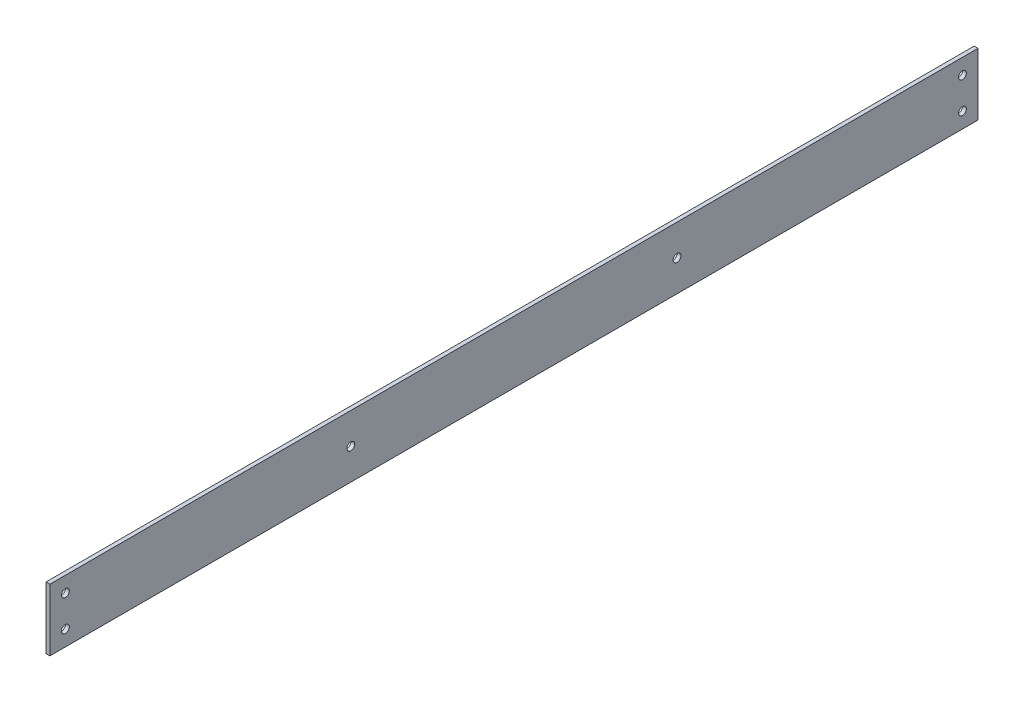
ISO-10303-21;
HEADER;
FILE_DESCRIPTION(('STEP AP214'),'2;1');
FILE_NAME('part.step','',(''),(''),'','','');
FILE_SCHEMA(('AUTOMOTIVE_DESIGN { 1 0 10303 214 1 1 1 1 }'));
ENDSEC;
DATA;
#1=APPLICATION_CONTEXT('core data for automotive mechanical design processes');
#2=APPLICATION_PROTOCOL_DEFINITION('international standard','automotive_design',2000,#1);
#3=PRODUCT_CONTEXT('',#1,'mechanical');
#4=PRODUCT('Part','Part','',(#3));
#5=PRODUCT_RELATED_PRODUCT_CATEGORY('part','',(#4));
#6=PRODUCT_DEFINITION_FORMATION('','',#4);
#7=PRODUCT_DEFINITION_CONTEXT('part definition',#1,'design');
#8=PRODUCT_DEFINITION('design','',#6,#7);
#9=PRODUCT_DEFINITION_SHAPE('','',#8);
#10=(LENGTH_UNIT() NAMED_UNIT(*) SI_UNIT(.MILLI.,.METRE.));
#11=(NAMED_UNIT(*) PLANE_ANGLE_UNIT() SI_UNIT($,.RADIAN.));
#12=(NAMED_UNIT(*) SI_UNIT($,.STERADIAN.) SOLID_ANGLE_UNIT());
#13=UNCERTAINTY_MEASURE_WITH_UNIT(LENGTH_MEASURE(1.E-05),#10,'distance_accuracy_value','');
#14=(GEOMETRIC_REPRESENTATION_CONTEXT(3) GLOBAL_UNCERTAINTY_ASSIGNED_CONTEXT((#13)) GLOBAL_UNIT_ASSIGNED_CONTEXT((#10,
#11,#12)) REPRESENTATION_CONTEXT('',''));
#15=CARTESIAN_POINT('',(0.,0.,0.));
#16=DIRECTION('',(0.,0.,1.));
#17=DIRECTION('',(1.,0.,0.));
#18=AXIS2_PLACEMENT_3D('',#15,#16,#17);
#19=CARTESIAN_POINT('',(1.5875,-25.4,809.625));
#20=DIRECTION('',(-1.,0.,0.));
#21=DIRECTION('',(0.,0.,1.));
#22=AXIS2_PLACEMENT_3D('',#19,#20,#21);
#23=PLANE('',#22);
#24=CARTESIAN_POINT('',(1.5875,0.,271.4625));
#25=DIRECTION('',(-1.,0.,0.));
#26=DIRECTION('',(0.,0.,1.));
#27=AXIS2_PLACEMENT_3D('',#24,#25,#26);
#28=CIRCLE('',#27,3.17499999999997);
#29=CARTESIAN_POINT('',(1.5875,0.,274.6375));
#30=VERTEX_POINT('',#29);
#31=EDGE_CURVE('E105',#30,#30,#28,.T.);
#32=ORIENTED_EDGE('',*,*,#31,.T.);
#33=EDGE_LOOP('',(#32));
#34=FACE_BOUND('',#33,.T.);
#35=CARTESIAN_POINT('',(1.5875,0.,538.1625));
#36=DIRECTION('',(-1.,0.,0.));
#37=DIRECTION('',(0.,0.,1.));
#38=AXIS2_PLACEMENT_3D('',#35,#36,#37);
#39=CIRCLE('',#38,3.17499999999997);
#40=CARTESIAN_POINT('',(1.5875,0.,541.3375));
#41=VERTEX_POINT('',#40);
#42=EDGE_CURVE('E184',#41,#41,#39,.T.);
#43=ORIENTED_EDGE('',*,*,#42,.T.);
#44=EDGE_LOOP('',(#43));
#45=FACE_BOUND('',#44,.T.);
#46=CARTESIAN_POINT('',(1.5875,-12.7,38.1));
#47=DIRECTION('',(1.,0.,0.));
#48=DIRECTION('',(0.,0.,-1.));
#49=AXIS2_PLACEMENT_3D('',#46,#47,#48);
#50=CIRCLE('',#49,3.175);
#51=CARTESIAN_POINT('',(1.5875,-12.7,34.925));
#52=VERTEX_POINT('',#51);
#53=EDGE_CURVE('E125',#52,#52,#50,.T.);
#54=ORIENTED_EDGE('',*,*,#53,.F.);
#55=EDGE_LOOP('',(#54));
#56=FACE_BOUND('',#55,.T.);
#57=CARTESIAN_POINT('',(1.5875,12.7,771.525));
#58=DIRECTION('',(1.,0.,0.));
#59=DIRECTION('',(0.,0.,1.));
#60=AXIS2_PLACEMENT_3D('',#57,#58,#59);
#61=CIRCLE('',#60,3.17500000000008);
#62=CARTESIAN_POINT('',(1.5875,12.7,774.7));
#63=VERTEX_POINT('',#62);
#64=EDGE_CURVE('E115',#63,#63,#61,.T.);
#65=ORIENTED_EDGE('',*,*,#64,.F.);
#66=EDGE_LOOP('',(#65));
#67=FACE_BOUND('',#66,.T.);
#68=CARTESIAN_POINT('',(1.5875,-12.7,771.525));
#69=DIRECTION('',(1.,0.,0.));
#70=DIRECTION('',(0.,0.,1.));
#71=AXIS2_PLACEMENT_3D('',#68,#69,#70);
#72=CIRCLE('',#71,3.17499999999986);
#73=CARTESIAN_POINT('',(1.5875,-12.7,774.7));
#74=VERTEX_POINT('',#73);
#75=EDGE_CURVE('E116',#74,#74,#72,.T.);
#76=ORIENTED_EDGE('',*,*,#75,.F.);
#77=EDGE_LOOP('',(#76));
#78=FACE_BOUND('',#77,.T.);
#79=CARTESIAN_POINT('',(1.5875,12.7,38.1));
#80=DIRECTION('',(1.,0.,0.));
#81=DIRECTION('',(0.,0.,-1.));
#82=AXIS2_PLACEMENT_3D('',#79,#80,#81);
#83=CIRCLE('',#82,3.175);
#84=CARTESIAN_POINT('',(1.5875,12.7,34.925));
#85=VERTEX_POINT('',#84);
#86=EDGE_CURVE('E124',#85,#85,#83,.T.);
#87=ORIENTED_EDGE('',*,*,#86,.F.);
#88=EDGE_LOOP('',(#87));
#89=FACE_BOUND('',#88,.T.);
#90=DIRECTION('',(0.,0.,-1.));
#91=VECTOR('',#90,1.);
#92=CARTESIAN_POINT('',(1.5875,25.4,809.625));
#93=LINE('',#92,#91);
#94=CARTESIAN_POINT('',(1.5875,25.4,784.225));
#95=VERTEX_POINT('',#94);
#96=CARTESIAN_POINT('',(1.5875,25.4,25.4));
#97=VERTEX_POINT('',#96);
#98=EDGE_CURVE('E11',#95,#97,#93,.T.);
#99=ORIENTED_EDGE('',*,*,#98,.F.);
#100=DIRECTION('',(0.,-1.,0.));
#101=VECTOR('',#100,1.);
#102=CARTESIAN_POINT('',(1.5875,-25.4,784.225));
#103=LINE('',#102,#101);
#104=CARTESIAN_POINT('',(1.5875,-25.4,784.225));
#105=VERTEX_POINT('',#104);
#106=EDGE_CURVE('E78',#95,#105,#103,.T.);
#107=ORIENTED_EDGE('',*,*,#106,.T.);
#108=DIRECTION('',(0.,0.,-1.));
#109=VECTOR('',#108,1.);
#110=CARTESIAN_POINT('',(1.5875,-25.4,809.625));
#111=LINE('',#110,#109);
#112=CARTESIAN_POINT('',(1.5875,-25.4,25.4));
#113=VERTEX_POINT('',#112);
#114=EDGE_CURVE('E96',#105,#113,#111,.T.);
#115=ORIENTED_EDGE('',*,*,#114,.T.);
#116=DIRECTION('',(0.,1.,0.));
#117=VECTOR('',#116,1.);
#118=CARTESIAN_POINT('',(1.5875,-25.4,25.4));
#119=LINE('',#118,#117);
#120=EDGE_CURVE('E62',#113,#97,#119,.T.);
#121=ORIENTED_EDGE('',*,*,#120,.T.);
#122=EDGE_LOOP('',(#99,#107,#115,#121));
#123=FACE_BOUND('',#122,.T.);
#124=ADVANCED_FACE('F39',(#34,#45,#56,#67,#78,#89,#123),#23,.F.);
#125=CARTESIAN_POINT('',(-1.5875,25.4,809.625));
#126=DIRECTION('',(0.,-1.,0.));
#127=DIRECTION('',(0.,0.,-1.));
#128=AXIS2_PLACEMENT_3D('',#125,#126,#127);
#129=PLANE('',#128);
#130=DIRECTION('',(0.,0.,-1.));
#131=VECTOR('',#130,1.);
#132=CARTESIAN_POINT('',(-1.5875,25.4,809.625));
#133=LINE('',#132,#131);
#134=CARTESIAN_POINT('',(-1.5875,25.4,784.225));
#135=VERTEX_POINT('',#134);
#136=CARTESIAN_POINT('',(-1.5875,25.4,25.4));
#137=VERTEX_POINT('',#136);
#138=EDGE_CURVE('E47',#135,#137,#133,.T.);
#139=ORIENTED_EDGE('',*,*,#138,.F.);
#140=DIRECTION('',(-1.,0.,0.));
#141=VECTOR('',#140,1.);
#142=CARTESIAN_POINT('',(1.5875,25.4,784.225));
#143=LINE('',#142,#141);
#144=EDGE_CURVE('E81',#95,#135,#143,.T.);
#145=ORIENTED_EDGE('',*,*,#144,.F.);
#146=ORIENTED_EDGE('',*,*,#98,.T.);
#147=DIRECTION('',(-1.,0.,0.));
#148=VECTOR('',#147,1.);
#149=CARTESIAN_POINT('',(1.5875,25.4,25.4));
#150=LINE('',#149,#148);
#151=EDGE_CURVE('E103',#97,#137,#150,.T.);
#152=ORIENTED_EDGE('',*,*,#151,.T.);
#153=EDGE_LOOP('',(#139,#145,#146,#152));
#154=FACE_BOUND('',#153,.T.);
#155=ADVANCED_FACE('F91',(#154),#129,.F.);
#156=CARTESIAN_POINT('',(-1.5875,-25.4,809.625));
#157=DIRECTION('',(1.,0.,0.));
#158=DIRECTION('',(0.,0.,-1.));
#159=AXIS2_PLACEMENT_3D('',#156,#157,#158);
#160=PLANE('',#159);
#161=CARTESIAN_POINT('',(-1.5875,0.,271.4625));
#162=DIRECTION('',(-1.,0.,0.));
#163=DIRECTION('',(0.,0.,1.));
#164=AXIS2_PLACEMENT_3D('',#161,#162,#163);
#165=CIRCLE('',#164,3.17499999999997);
#166=CARTESIAN_POINT('',(-1.5875,0.,274.6375));
#167=VERTEX_POINT('',#166);
#168=EDGE_CURVE('E214',#167,#167,#165,.T.);
#169=ORIENTED_EDGE('',*,*,#168,.F.);
#170=EDGE_LOOP('',(#169));
#171=FACE_BOUND('',#170,.T.);
#172=CARTESIAN_POINT('',(-1.5875,0.,538.1625));
#173=DIRECTION('',(-1.,0.,0.));
#174=DIRECTION('',(0.,0.,1.));
#175=AXIS2_PLACEMENT_3D('',#172,#173,#174);
#176=CIRCLE('',#175,3.17499999999997);
#177=CARTESIAN_POINT('',(-1.5875,0.,541.3375));
#178=VERTEX_POINT('',#177);
#179=EDGE_CURVE('E218',#178,#178,#176,.T.);
#180=ORIENTED_EDGE('',*,*,#179,.F.);
#181=EDGE_LOOP('',(#180));
#182=FACE_BOUND('',#181,.T.);
#183=CARTESIAN_POINT('',(-1.5875,-12.7,38.1));
#184=DIRECTION('',(1.,0.,0.));
#185=DIRECTION('',(0.,0.,-1.));
#186=AXIS2_PLACEMENT_3D('',#183,#184,#185);
#187=CIRCLE('',#186,3.175);
#188=CARTESIAN_POINT('',(-1.5875,-12.7,34.925));
#189=VERTEX_POINT('',#188);
#190=EDGE_CURVE('E120',#189,#189,#187,.T.);
#191=ORIENTED_EDGE('',*,*,#190,.T.);
#192=EDGE_LOOP('',(#191));
#193=FACE_BOUND('',#192,.T.);
#194=CARTESIAN_POINT('',(-1.5875,12.7,771.525));
#195=DIRECTION('',(1.,0.,0.));
#196=DIRECTION('',(0.,0.,1.));
#197=AXIS2_PLACEMENT_3D('',#194,#195,#196);
#198=CIRCLE('',#197,3.17500000000008);
#199=CARTESIAN_POINT('',(-1.5875,12.7,774.7));
#200=VERTEX_POINT('',#199);
#201=EDGE_CURVE('E129',#200,#200,#198,.T.);
#202=ORIENTED_EDGE('',*,*,#201,.T.);
#203=EDGE_LOOP('',(#202));
#204=FACE_BOUND('',#203,.T.);
#205=CARTESIAN_POINT('',(-1.5875,-12.7,771.525));
#206=DIRECTION('',(1.,0.,0.));
#207=DIRECTION('',(0.,0.,1.));
#208=AXIS2_PLACEMENT_3D('',#205,#206,#207);
#209=CIRCLE('',#208,3.17499999999986);
#210=CARTESIAN_POINT('',(-1.5875,-12.7,774.7));
#211=VERTEX_POINT('',#210);
#212=EDGE_CURVE('E111',#211,#211,#209,.T.);
#213=ORIENTED_EDGE('',*,*,#212,.T.);
#214=EDGE_LOOP('',(#213));
#215=FACE_BOUND('',#214,.T.);
#216=CARTESIAN_POINT('',(-1.5875,12.7,38.1));
#217=DIRECTION('',(1.,0.,0.));
#218=DIRECTION('',(0.,0.,-1.));
#219=AXIS2_PLACEMENT_3D('',#216,#217,#218);
#220=CIRCLE('',#219,3.175);
#221=CARTESIAN_POINT('',(-1.5875,12.7,34.925));
#222=VERTEX_POINT('',#221);
#223=EDGE_CURVE('E136',#222,#222,#220,.T.);
#224=ORIENTED_EDGE('',*,*,#223,.T.);
#225=EDGE_LOOP('',(#224));
#226=FACE_BOUND('',#225,.T.);
#227=DIRECTION('',(0.,0.,-1.));
#228=VECTOR('',#227,1.);
#229=CARTESIAN_POINT('',(-1.5875,-25.4,809.625));
#230=LINE('',#229,#228);
#231=CARTESIAN_POINT('',(-1.5875,-25.4,784.225));
#232=VERTEX_POINT('',#231);
#233=CARTESIAN_POINT('',(-1.5875,-25.4,25.4));
#234=VERTEX_POINT('',#233);
#235=EDGE_CURVE('E145',#232,#234,#230,.T.);
#236=ORIENTED_EDGE('',*,*,#235,.F.);
#237=DIRECTION('',(0.,-1.,0.));
#238=VECTOR('',#237,1.);
#239=CARTESIAN_POINT('',(-1.5875,-25.4,784.225));
#240=LINE('',#239,#238);
#241=EDGE_CURVE('E54',#135,#232,#240,.T.);
#242=ORIENTED_EDGE('',*,*,#241,.F.);
#243=ORIENTED_EDGE('',*,*,#138,.T.);
#244=DIRECTION('',(0.,1.,0.));
#245=VECTOR('',#244,1.);
#246=CARTESIAN_POINT('',(-1.5875,-25.4,25.4));
#247=LINE('',#246,#245);
#248=EDGE_CURVE('E99',#234,#137,#247,.T.);
#249=ORIENTED_EDGE('',*,*,#248,.F.);
#250=EDGE_LOOP('',(#236,#242,#243,#249));
#251=FACE_BOUND('',#250,.T.);
#252=ADVANCED_FACE('F152',(#171,#182,#193,#204,#215,#226,#251),#160,.F.);
#253=CARTESIAN_POINT('',(-1.5875,-25.4,809.625));
#254=DIRECTION('',(0.,1.,0.));
#255=DIRECTION('',(0.,0.,1.));
#256=AXIS2_PLACEMENT_3D('',#253,#254,#255);
#257=PLANE('',#256);
#258=ORIENTED_EDGE('',*,*,#114,.F.);
#259=DIRECTION('',(-1.,0.,0.));
#260=VECTOR('',#259,1.);
#261=CARTESIAN_POINT('',(1.5875,-25.4,784.225));
#262=LINE('',#261,#260);
#263=EDGE_CURVE('E82',#105,#232,#262,.T.);
#264=ORIENTED_EDGE('',*,*,#263,.T.);
#265=ORIENTED_EDGE('',*,*,#235,.T.);
#266=DIRECTION('',(-1.,0.,0.));
#267=VECTOR('',#266,1.);
#268=CARTESIAN_POINT('',(1.5875,-25.4,25.4));
#269=LINE('',#268,#267);
#270=EDGE_CURVE('E98',#113,#234,#269,.T.);
#271=ORIENTED_EDGE('',*,*,#270,.F.);
#272=EDGE_LOOP('',(#258,#264,#265,#271));
#273=FACE_BOUND('',#272,.T.);
#274=ADVANCED_FACE('F158',(#273),#257,.F.);
#275=CARTESIAN_POINT('',(-1.5875,12.7,38.1));
#276=DIRECTION('',(1.,0.,0.));
#277=DIRECTION('',(0.,0.,-1.));
#278=AXIS2_PLACEMENT_3D('',#275,#276,#277);
#279=CYLINDRICAL_SURFACE('',#278,3.175);
#280=ORIENTED_EDGE('',*,*,#223,.F.);
#281=EDGE_LOOP('',(#280));
#282=FACE_BOUND('',#281,.T.);
#283=ORIENTED_EDGE('',*,*,#86,.T.);
#284=EDGE_LOOP('',(#283));
#285=FACE_BOUND('',#284,.T.);
#286=ADVANCED_FACE('F193',(#282,#285),#279,.F.);
#287=CARTESIAN_POINT('',(-1.5875,-12.7,771.525));
#288=DIRECTION('',(1.,0.,0.));
#289=DIRECTION('',(0.,0.,-1.));
#290=AXIS2_PLACEMENT_3D('',#287,#288,#289);
#291=CYLINDRICAL_SURFACE('',#290,3.17499999999986);
#292=ORIENTED_EDGE('',*,*,#212,.F.);
#293=EDGE_LOOP('',(#292));
#294=FACE_BOUND('',#293,.T.);
#295=ORIENTED_EDGE('',*,*,#75,.T.);
#296=EDGE_LOOP('',(#295));
#297=FACE_BOUND('',#296,.T.);
#298=ADVANCED_FACE('F195',(#294,#297),#291,.F.);
#299=CARTESIAN_POINT('',(-1.5875,12.7,771.525));
#300=DIRECTION('',(1.,0.,0.));
#301=DIRECTION('',(0.,0.,-1.));
#302=AXIS2_PLACEMENT_3D('',#299,#300,#301);
#303=CYLINDRICAL_SURFACE('',#302,3.17500000000008);
#304=ORIENTED_EDGE('',*,*,#201,.F.);
#305=EDGE_LOOP('',(#304));
#306=FACE_BOUND('',#305,.T.);
#307=ORIENTED_EDGE('',*,*,#64,.T.);
#308=EDGE_LOOP('',(#307));
#309=FACE_BOUND('',#308,.T.);
#310=ADVANCED_FACE('F169',(#306,#309),#303,.F.);
#311=CARTESIAN_POINT('',(-1.5875,-12.7,38.1));
#312=DIRECTION('',(1.,0.,0.));
#313=DIRECTION('',(0.,0.,-1.));
#314=AXIS2_PLACEMENT_3D('',#311,#312,#313);
#315=CYLINDRICAL_SURFACE('',#314,3.175);
#316=ORIENTED_EDGE('',*,*,#190,.F.);
#317=EDGE_LOOP('',(#316));
#318=FACE_BOUND('',#317,.T.);
#319=ORIENTED_EDGE('',*,*,#53,.T.);
#320=EDGE_LOOP('',(#319));
#321=FACE_BOUND('',#320,.T.);
#322=ADVANCED_FACE('F161',(#318,#321),#315,.F.);
#323=CARTESIAN_POINT('',(1.5875,-25.4,25.4));
#324=DIRECTION('',(0.,0.,1.));
#325=DIRECTION('',(0.,-1.,0.));
#326=AXIS2_PLACEMENT_3D('',#323,#324,#325);
#327=PLANE('',#326);
#328=ORIENTED_EDGE('',*,*,#248,.T.);
#329=ORIENTED_EDGE('',*,*,#151,.F.);
#330=ORIENTED_EDGE('',*,*,#120,.F.);
#331=ORIENTED_EDGE('',*,*,#270,.T.);
#332=EDGE_LOOP('',(#328,#329,#330,#331));
#333=FACE_BOUND('',#332,.T.);
#334=ADVANCED_FACE('F159',(#333),#327,.F.);
#335=CARTESIAN_POINT('',(1.5875,-25.4,784.225));
#336=DIRECTION('',(0.,0.,-1.));
#337=DIRECTION('',(-1.,0.,0.));
#338=AXIS2_PLACEMENT_3D('',#335,#336,#337);
#339=PLANE('',#338);
#340=ORIENTED_EDGE('',*,*,#241,.T.);
#341=ORIENTED_EDGE('',*,*,#263,.F.);
#342=ORIENTED_EDGE('',*,*,#106,.F.);
#343=ORIENTED_EDGE('',*,*,#144,.T.);
#344=EDGE_LOOP('',(#340,#341,#342,#343));
#345=FACE_BOUND('',#344,.T.);
#346=ADVANCED_FACE('F80',(#345),#339,.F.);
#347=CARTESIAN_POINT('',(1.5875,0.,538.1625));
#348=DIRECTION('',(-1.,0.,0.));
#349=DIRECTION('',(0.,0.,1.));
#350=AXIS2_PLACEMENT_3D('',#347,#348,#349);
#351=CYLINDRICAL_SURFACE('',#350,3.17499999999997);
#352=ORIENTED_EDGE('',*,*,#42,.F.);
#353=EDGE_LOOP('',(#352));
#354=FACE_BOUND('',#353,.T.);
#355=ORIENTED_EDGE('',*,*,#179,.T.);
#356=EDGE_LOOP('',(#355));
#357=FACE_BOUND('',#356,.T.);
#358=ADVANCED_FACE('F167',(#354,#357),#351,.F.);
#359=CARTESIAN_POINT('',(1.5875,0.,271.4625));
#360=DIRECTION('',(-1.,0.,0.));
#361=DIRECTION('',(0.,0.,1.));
#362=AXIS2_PLACEMENT_3D('',#359,#360,#361);
#363=CYLINDRICAL_SURFACE('',#362,3.17499999999997);
#364=ORIENTED_EDGE('',*,*,#31,.F.);
#365=EDGE_LOOP('',(#364));
#366=FACE_BOUND('',#365,.T.);
#367=ORIENTED_EDGE('',*,*,#168,.T.);
#368=EDGE_LOOP('',(#367));
#369=FACE_BOUND('',#368,.T.);
#370=ADVANCED_FACE('F277',(#366,#369),#363,.F.);
#371=CLOSED_SHELL('',(#124,#155,#252,#274,#286,#298,#310,#322,#334,#346,#358,#370));
#372=MANIFOLD_SOLID_BREP('B2',#371);
#373=ADVANCED_BREP_SHAPE_REPRESENTATION('',(#18,#372),#14);
#374=SHAPE_DEFINITION_REPRESENTATION(#9,#373);
ENDSEC;
END-ISO-10303-21;
